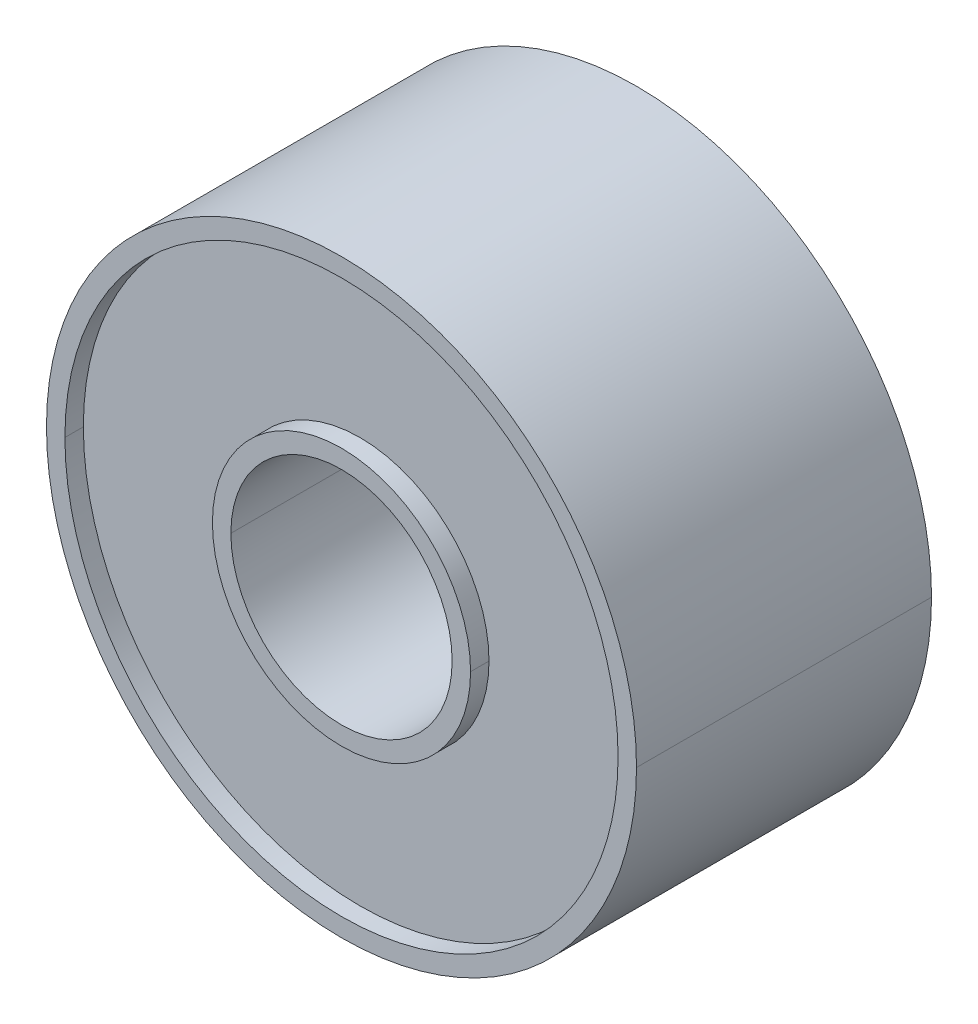
ISO-10303-21;
HEADER;
FILE_DESCRIPTION(('STEP AP214'),'2;1');
FILE_NAME('part.step','',(''),(''),'','','');
FILE_SCHEMA(('AUTOMOTIVE_DESIGN { 1 0 10303 214 1 1 1 1 }'));
ENDSEC;
DATA;
#1=APPLICATION_CONTEXT('core data for automotive mechanical design processes');
#2=APPLICATION_PROTOCOL_DEFINITION('international standard','automotive_design',2000,#1);
#3=PRODUCT_CONTEXT('',#1,'mechanical');
#4=PRODUCT('Part','Part','',(#3));
#5=PRODUCT_RELATED_PRODUCT_CATEGORY('part','',(#4));
#6=PRODUCT_DEFINITION_FORMATION('','',#4);
#7=PRODUCT_DEFINITION_CONTEXT('part definition',#1,'design');
#8=PRODUCT_DEFINITION('design','',#6,#7);
#9=PRODUCT_DEFINITION_SHAPE('','',#8);
#10=(LENGTH_UNIT() NAMED_UNIT(*) SI_UNIT(.MILLI.,.METRE.));
#11=(NAMED_UNIT(*) PLANE_ANGLE_UNIT() SI_UNIT($,.RADIAN.));
#12=(NAMED_UNIT(*) SI_UNIT($,.STERADIAN.) SOLID_ANGLE_UNIT());
#13=UNCERTAINTY_MEASURE_WITH_UNIT(LENGTH_MEASURE(1.E-05),#10,'distance_accuracy_value','');
#14=(GEOMETRIC_REPRESENTATION_CONTEXT(3) GLOBAL_UNCERTAINTY_ASSIGNED_CONTEXT((#13)) GLOBAL_UNIT_ASSIGNED_CONTEXT((#10,
#11,#12)) REPRESENTATION_CONTEXT('',''));
#15=CARTESIAN_POINT('',(0.,0.,0.));
#16=DIRECTION('',(0.,0.,1.));
#17=DIRECTION('',(1.,0.,0.));
#18=AXIS2_PLACEMENT_3D('',#15,#16,#17);
#19=CARTESIAN_POINT('',(0.,0.,0.25));
#20=DIRECTION('',(0.,0.,-1.));
#21=DIRECTION('',(0.,-1.,0.));
#22=AXIS2_PLACEMENT_3D('',#19,#20,#21);
#23=CYLINDRICAL_SURFACE('',#22,1.75);
#24=CARTESIAN_POINT('',(0.,0.,0.25));
#25=DIRECTION('',(0.,0.,-1.));
#26=DIRECTION('',(-1.,0.,0.));
#27=AXIS2_PLACEMENT_3D('',#24,#25,#26);
#28=CIRCLE('',#27,1.75);
#29=CARTESIAN_POINT('',(-1.75,0.,0.25));
#30=VERTEX_POINT('',#29);
#31=CARTESIAN_POINT('',(1.75,0.,0.25));
#32=VERTEX_POINT('',#31);
#33=EDGE_CURVE('E11',#30,#32,#28,.T.);
#34=ORIENTED_EDGE('',*,*,#33,.T.);
#35=DIRECTION('',(0.,0.,-1.));
#36=VECTOR('',#35,1.);
#37=CARTESIAN_POINT('',(1.75,0.,0.25));
#38=LINE('',#37,#36);
#39=CARTESIAN_POINT('',(1.75,0.,0.));
#40=VERTEX_POINT('',#39);
#41=EDGE_CURVE('E25',#32,#40,#38,.T.);
#42=ORIENTED_EDGE('',*,*,#41,.T.);
#43=CARTESIAN_POINT('',(0.,0.,0.));
#44=DIRECTION('',(0.,0.,-1.));
#45=DIRECTION('',(-1.,0.,0.));
#46=AXIS2_PLACEMENT_3D('',#43,#44,#45);
#47=CIRCLE('',#46,1.75);
#48=CARTESIAN_POINT('',(-1.75,0.,0.));
#49=VERTEX_POINT('',#48);
#50=EDGE_CURVE('E253',#49,#40,#47,.T.);
#51=ORIENTED_EDGE('',*,*,#50,.F.);
#52=DIRECTION('',(0.,0.,-1.));
#53=VECTOR('',#52,1.);
#54=CARTESIAN_POINT('',(-1.75,0.,0.25));
#55=LINE('',#54,#53);
#56=EDGE_CURVE('E248',#30,#49,#55,.T.);
#57=ORIENTED_EDGE('',*,*,#56,.F.);
#58=EDGE_LOOP('',(#34,#42,#51,#57));
#59=FACE_BOUND('',#58,.T.);
#60=ADVANCED_FACE('F17',(#59),#23,.T.);
#61=CARTESIAN_POINT('',(0.,0.,0.25));
#62=DIRECTION('',(0.,0.,-1.));
#63=DIRECTION('',(0.,1.,0.));
#64=AXIS2_PLACEMENT_3D('',#61,#62,#63);
#65=CYLINDRICAL_SURFACE('',#64,1.75);
#66=ORIENTED_EDGE('',*,*,#41,.F.);
#67=CARTESIAN_POINT('',(0.,0.,0.25));
#68=DIRECTION('',(0.,0.,-1.));
#69=DIRECTION('',(-1.,0.,0.));
#70=AXIS2_PLACEMENT_3D('',#67,#68,#69);
#71=CIRCLE('',#70,1.75);
#72=EDGE_CURVE('E243',#32,#30,#71,.T.);
#73=ORIENTED_EDGE('',*,*,#72,.T.);
#74=ORIENTED_EDGE('',*,*,#56,.T.);
#75=CARTESIAN_POINT('',(0.,0.,0.));
#76=DIRECTION('',(0.,0.,-1.));
#77=DIRECTION('',(-1.,0.,0.));
#78=AXIS2_PLACEMENT_3D('',#75,#76,#77);
#79=CIRCLE('',#78,1.75);
#80=EDGE_CURVE('E238',#40,#49,#79,.T.);
#81=ORIENTED_EDGE('',*,*,#80,.F.);
#82=EDGE_LOOP('',(#66,#73,#74,#81));
#83=FACE_BOUND('',#82,.T.);
#84=ADVANCED_FACE('F265',(#83),#65,.T.);
#85=CARTESIAN_POINT('',(0.,0.,0.));
#86=DIRECTION('',(0.,0.,1.));
#87=DIRECTION('',(1.,0.,0.));
#88=AXIS2_PLACEMENT_3D('',#85,#86,#87);
#89=PLANE('',#88);
#90=CARTESIAN_POINT('',(0.,0.,0.));
#91=DIRECTION('',(0.,0.,1.));
#92=DIRECTION('',(1.,0.,0.));
#93=AXIS2_PLACEMENT_3D('',#90,#91,#92);
#94=CIRCLE('',#93,1.5);
#95=CARTESIAN_POINT('',(-1.5,0.,0.));
#96=VERTEX_POINT('',#95);
#97=CARTESIAN_POINT('',(1.5,0.,0.));
#98=VERTEX_POINT('',#97);
#99=EDGE_CURVE('E234',#96,#98,#94,.T.);
#100=ORIENTED_EDGE('',*,*,#99,.T.);
#101=CARTESIAN_POINT('',(0.,0.,0.));
#102=DIRECTION('',(0.,0.,1.));
#103=DIRECTION('',(1.,0.,0.));
#104=AXIS2_PLACEMENT_3D('',#101,#102,#103);
#105=CIRCLE('',#104,1.5);
#106=EDGE_CURVE('E230',#98,#96,#105,.T.);
#107=ORIENTED_EDGE('',*,*,#106,.T.);
#108=EDGE_LOOP('',(#100,#107));
#109=FACE_BOUND('',#108,.T.);
#110=ORIENTED_EDGE('',*,*,#50,.T.);
#111=ORIENTED_EDGE('',*,*,#80,.T.);
#112=EDGE_LOOP('',(#110,#111));
#113=FACE_BOUND('',#112,.T.);
#114=ADVANCED_FACE('F263',(#109,#113),#89,.F.);
#115=CARTESIAN_POINT('',(0.,0.,4.));
#116=DIRECTION('',(0.,0.,-1.));
#117=DIRECTION('',(0.,-1.,0.));
#118=AXIS2_PLACEMENT_3D('',#115,#116,#117);
#119=CYLINDRICAL_SURFACE('',#118,1.5);
#120=DIRECTION('',(0.,0.,-1.));
#121=VECTOR('',#120,1.);
#122=CARTESIAN_POINT('',(1.5,0.,4.));
#123=LINE('',#122,#121);
#124=CARTESIAN_POINT('',(1.5,0.,4.));
#125=VERTEX_POINT('',#124);
#126=EDGE_CURVE('E225',#125,#98,#123,.T.);
#127=ORIENTED_EDGE('',*,*,#126,.F.);
#128=CARTESIAN_POINT('',(0.,0.,4.));
#129=DIRECTION('',(0.,0.,1.));
#130=DIRECTION('',(1.,0.,0.));
#131=AXIS2_PLACEMENT_3D('',#128,#129,#130);
#132=CIRCLE('',#131,1.5);
#133=CARTESIAN_POINT('',(-1.5,0.,4.));
#134=VERTEX_POINT('',#133);
#135=EDGE_CURVE('E221',#125,#134,#132,.T.);
#136=ORIENTED_EDGE('',*,*,#135,.T.);
#137=DIRECTION('',(0.,0.,-1.));
#138=VECTOR('',#137,1.);
#139=CARTESIAN_POINT('',(-1.5,0.,4.));
#140=LINE('',#139,#138);
#141=EDGE_CURVE('E216',#134,#96,#140,.T.);
#142=ORIENTED_EDGE('',*,*,#141,.T.);
#143=ORIENTED_EDGE('',*,*,#106,.F.);
#144=EDGE_LOOP('',(#127,#136,#142,#143));
#145=FACE_BOUND('',#144,.T.);
#146=ADVANCED_FACE('F281',(#145),#119,.F.);
#147=CARTESIAN_POINT('',(0.,0.,4.));
#148=DIRECTION('',(0.,0.,-1.));
#149=DIRECTION('',(0.,1.,0.));
#150=AXIS2_PLACEMENT_3D('',#147,#148,#149);
#151=CYLINDRICAL_SURFACE('',#150,1.5);
#152=CARTESIAN_POINT('',(0.,0.,4.));
#153=DIRECTION('',(0.,0.,1.));
#154=DIRECTION('',(1.,0.,0.));
#155=AXIS2_PLACEMENT_3D('',#152,#153,#154);
#156=CIRCLE('',#155,1.5);
#157=EDGE_CURVE('E211',#134,#125,#156,.T.);
#158=ORIENTED_EDGE('',*,*,#157,.T.);
#159=ORIENTED_EDGE('',*,*,#126,.T.);
#160=ORIENTED_EDGE('',*,*,#99,.F.);
#161=ORIENTED_EDGE('',*,*,#141,.F.);
#162=EDGE_LOOP('',(#158,#159,#160,#161));
#163=FACE_BOUND('',#162,.T.);
#164=ADVANCED_FACE('F287',(#163),#151,.F.);
#165=CARTESIAN_POINT('',(0.,0.,4.));
#166=DIRECTION('',(0.,0.,1.));
#167=DIRECTION('',(1.,0.,0.));
#168=AXIS2_PLACEMENT_3D('',#165,#166,#167);
#169=PLANE('',#168);
#170=ORIENTED_EDGE('',*,*,#157,.F.);
#171=ORIENTED_EDGE('',*,*,#135,.F.);
#172=EDGE_LOOP('',(#170,#171));
#173=FACE_BOUND('',#172,.T.);
#174=CARTESIAN_POINT('',(0.,0.,4.));
#175=DIRECTION('',(0.,0.,1.));
#176=DIRECTION('',(1.,0.,0.));
#177=AXIS2_PLACEMENT_3D('',#174,#175,#176);
#178=CIRCLE('',#177,1.75);
#179=CARTESIAN_POINT('',(1.75,0.,4.));
#180=VERTEX_POINT('',#179);
#181=CARTESIAN_POINT('',(-1.75,0.,4.));
#182=VERTEX_POINT('',#181);
#183=EDGE_CURVE('E207',#180,#182,#178,.T.);
#184=ORIENTED_EDGE('',*,*,#183,.T.);
#185=CARTESIAN_POINT('',(0.,0.,4.));
#186=DIRECTION('',(0.,0.,1.));
#187=DIRECTION('',(1.,0.,0.));
#188=AXIS2_PLACEMENT_3D('',#185,#186,#187);
#189=CIRCLE('',#188,1.75);
#190=EDGE_CURVE('E203',#182,#180,#189,.T.);
#191=ORIENTED_EDGE('',*,*,#190,.T.);
#192=EDGE_LOOP('',(#184,#191));
#193=FACE_BOUND('',#192,.T.);
#194=ADVANCED_FACE('F291',(#173,#193),#169,.T.);
#195=CARTESIAN_POINT('',(0.,0.,3.75));
#196=DIRECTION('',(0.,0.,1.));
#197=DIRECTION('',(0.,1.,0.));
#198=AXIS2_PLACEMENT_3D('',#195,#196,#197);
#199=CYLINDRICAL_SURFACE('',#198,1.75);
#200=DIRECTION('',(0.,0.,1.));
#201=VECTOR('',#200,1.);
#202=CARTESIAN_POINT('',(-1.75,0.,3.75));
#203=LINE('',#202,#201);
#204=CARTESIAN_POINT('',(-1.75,0.,3.75));
#205=VERTEX_POINT('',#204);
#206=EDGE_CURVE('E198',#205,#182,#203,.T.);
#207=ORIENTED_EDGE('',*,*,#206,.F.);
#208=CARTESIAN_POINT('',(0.,0.,3.75));
#209=DIRECTION('',(0.,0.,1.));
#210=DIRECTION('',(1.,0.,0.));
#211=AXIS2_PLACEMENT_3D('',#208,#209,#210);
#212=CIRCLE('',#211,1.75);
#213=CARTESIAN_POINT('',(1.75,0.,3.75));
#214=VERTEX_POINT('',#213);
#215=EDGE_CURVE('E194',#205,#214,#212,.T.);
#216=ORIENTED_EDGE('',*,*,#215,.T.);
#217=DIRECTION('',(0.,0.,1.));
#218=VECTOR('',#217,1.);
#219=CARTESIAN_POINT('',(1.75,0.,3.75));
#220=LINE('',#219,#218);
#221=EDGE_CURVE('E189',#214,#180,#220,.T.);
#222=ORIENTED_EDGE('',*,*,#221,.T.);
#223=ORIENTED_EDGE('',*,*,#190,.F.);
#224=EDGE_LOOP('',(#207,#216,#222,#223));
#225=FACE_BOUND('',#224,.T.);
#226=ADVANCED_FACE('F295',(#225),#199,.T.);
#227=CARTESIAN_POINT('',(0.,0.,3.75));
#228=DIRECTION('',(0.,0.,1.));
#229=DIRECTION('',(0.,-1.,0.));
#230=AXIS2_PLACEMENT_3D('',#227,#228,#229);
#231=CYLINDRICAL_SURFACE('',#230,1.75);
#232=CARTESIAN_POINT('',(0.,0.,3.75));
#233=DIRECTION('',(0.,0.,1.));
#234=DIRECTION('',(1.,0.,0.));
#235=AXIS2_PLACEMENT_3D('',#232,#233,#234);
#236=CIRCLE('',#235,1.75);
#237=EDGE_CURVE('E184',#214,#205,#236,.T.);
#238=ORIENTED_EDGE('',*,*,#237,.T.);
#239=ORIENTED_EDGE('',*,*,#206,.T.);
#240=ORIENTED_EDGE('',*,*,#183,.F.);
#241=ORIENTED_EDGE('',*,*,#221,.F.);
#242=EDGE_LOOP('',(#238,#239,#240,#241));
#243=FACE_BOUND('',#242,.T.);
#244=ADVANCED_FACE('F299',(#243),#231,.T.);
#245=CARTESIAN_POINT('',(0.,0.,3.75));
#246=DIRECTION('',(0.,0.,1.));
#247=DIRECTION('',(1.,0.,0.));
#248=AXIS2_PLACEMENT_3D('',#245,#246,#247);
#249=PLANE('',#248);
#250=ORIENTED_EDGE('',*,*,#237,.F.);
#251=ORIENTED_EDGE('',*,*,#215,.F.);
#252=EDGE_LOOP('',(#250,#251));
#253=FACE_BOUND('',#252,.T.);
#254=CARTESIAN_POINT('',(0.,0.,3.75));
#255=DIRECTION('',(0.,0.,1.));
#256=DIRECTION('',(1.,0.,0.));
#257=AXIS2_PLACEMENT_3D('',#254,#255,#256);
#258=CIRCLE('',#257,3.75);
#259=CARTESIAN_POINT('',(3.75,0.,3.75));
#260=VERTEX_POINT('',#259);
#261=CARTESIAN_POINT('',(-3.75,0.,3.75));
#262=VERTEX_POINT('',#261);
#263=EDGE_CURVE('E180',#260,#262,#258,.T.);
#264=ORIENTED_EDGE('',*,*,#263,.T.);
#265=CARTESIAN_POINT('',(0.,0.,3.75));
#266=DIRECTION('',(0.,0.,1.));
#267=DIRECTION('',(1.,0.,0.));
#268=AXIS2_PLACEMENT_3D('',#265,#266,#267);
#269=CIRCLE('',#268,3.75);
#270=EDGE_CURVE('E176',#262,#260,#269,.T.);
#271=ORIENTED_EDGE('',*,*,#270,.T.);
#272=EDGE_LOOP('',(#264,#271));
#273=FACE_BOUND('',#272,.T.);
#274=ADVANCED_FACE('F303',(#253,#273),#249,.T.);
#275=CARTESIAN_POINT('',(0.,0.,3.75));
#276=DIRECTION('',(0.,0.,1.));
#277=DIRECTION('',(0.,1.,0.));
#278=AXIS2_PLACEMENT_3D('',#275,#276,#277);
#279=CYLINDRICAL_SURFACE('',#278,3.75);
#280=ORIENTED_EDGE('',*,*,#270,.F.);
#281=DIRECTION('',(0.,0.,1.));
#282=VECTOR('',#281,1.);
#283=CARTESIAN_POINT('',(-3.75,0.,3.75));
#284=LINE('',#283,#282);
#285=CARTESIAN_POINT('',(-3.75,0.,4.));
#286=VERTEX_POINT('',#285);
#287=EDGE_CURVE('E172',#262,#286,#284,.T.);
#288=ORIENTED_EDGE('',*,*,#287,.T.);
#289=CARTESIAN_POINT('',(0.,0.,4.));
#290=DIRECTION('',(0.,0.,1.));
#291=DIRECTION('',(1.,0.,0.));
#292=AXIS2_PLACEMENT_3D('',#289,#290,#291);
#293=CIRCLE('',#292,3.75);
#294=CARTESIAN_POINT('',(3.75,0.,4.));
#295=VERTEX_POINT('',#294);
#296=EDGE_CURVE('E168',#286,#295,#293,.T.);
#297=ORIENTED_EDGE('',*,*,#296,.T.);
#298=DIRECTION('',(0.,0.,1.));
#299=VECTOR('',#298,1.);
#300=CARTESIAN_POINT('',(3.75,0.,3.75));
#301=LINE('',#300,#299);
#302=EDGE_CURVE('E163',#260,#295,#301,.T.);
#303=ORIENTED_EDGE('',*,*,#302,.F.);
#304=EDGE_LOOP('',(#280,#288,#297,#303));
#305=FACE_BOUND('',#304,.T.);
#306=ADVANCED_FACE('F307',(#305),#279,.F.);
#307=CARTESIAN_POINT('',(0.,0.,3.75));
#308=DIRECTION('',(0.,0.,1.));
#309=DIRECTION('',(0.,-1.,0.));
#310=AXIS2_PLACEMENT_3D('',#307,#308,#309);
#311=CYLINDRICAL_SURFACE('',#310,3.75);
#312=ORIENTED_EDGE('',*,*,#287,.F.);
#313=ORIENTED_EDGE('',*,*,#263,.F.);
#314=ORIENTED_EDGE('',*,*,#302,.T.);
#315=CARTESIAN_POINT('',(0.,0.,4.));
#316=DIRECTION('',(0.,0.,1.));
#317=DIRECTION('',(1.,0.,0.));
#318=AXIS2_PLACEMENT_3D('',#315,#316,#317);
#319=CIRCLE('',#318,3.75);
#320=EDGE_CURVE('E158',#295,#286,#319,.T.);
#321=ORIENTED_EDGE('',*,*,#320,.T.);
#322=EDGE_LOOP('',(#312,#313,#314,#321));
#323=FACE_BOUND('',#322,.T.);
#324=ADVANCED_FACE('F311',(#323),#311,.F.);
#325=CARTESIAN_POINT('',(0.,0.,4.));
#326=DIRECTION('',(0.,0.,1.));
#327=DIRECTION('',(1.,0.,0.));
#328=AXIS2_PLACEMENT_3D('',#325,#326,#327);
#329=PLANE('',#328);
#330=ORIENTED_EDGE('',*,*,#320,.F.);
#331=ORIENTED_EDGE('',*,*,#296,.F.);
#332=EDGE_LOOP('',(#330,#331));
#333=FACE_BOUND('',#332,.T.);
#334=CARTESIAN_POINT('',(0.,0.,4.));
#335=DIRECTION('',(0.,0.,1.));
#336=DIRECTION('',(1.,0.,0.));
#337=AXIS2_PLACEMENT_3D('',#334,#335,#336);
#338=CIRCLE('',#337,4.);
#339=CARTESIAN_POINT('',(-4.,0.,4.));
#340=VERTEX_POINT('',#339);
#341=CARTESIAN_POINT('',(4.,0.,4.));
#342=VERTEX_POINT('',#341);
#343=EDGE_CURVE('E154',#340,#342,#338,.T.);
#344=ORIENTED_EDGE('',*,*,#343,.T.);
#345=CARTESIAN_POINT('',(0.,0.,4.));
#346=DIRECTION('',(0.,0.,1.));
#347=DIRECTION('',(1.,0.,0.));
#348=AXIS2_PLACEMENT_3D('',#345,#346,#347);
#349=CIRCLE('',#348,4.);
#350=EDGE_CURVE('E150',#342,#340,#349,.T.);
#351=ORIENTED_EDGE('',*,*,#350,.T.);
#352=EDGE_LOOP('',(#344,#351));
#353=FACE_BOUND('',#352,.T.);
#354=ADVANCED_FACE('F315',(#333,#353),#329,.T.);
#355=CARTESIAN_POINT('',(0.,0.,4.));
#356=DIRECTION('',(0.,0.,-1.));
#357=DIRECTION('',(0.,-1.,0.));
#358=AXIS2_PLACEMENT_3D('',#355,#356,#357);
#359=CYLINDRICAL_SURFACE('',#358,4.);
#360=ORIENTED_EDGE('',*,*,#350,.F.);
#361=DIRECTION('',(0.,0.,-1.));
#362=VECTOR('',#361,1.);
#363=CARTESIAN_POINT('',(4.,0.,4.));
#364=LINE('',#363,#362);
#365=CARTESIAN_POINT('',(4.,0.,0.));
#366=VERTEX_POINT('',#365);
#367=EDGE_CURVE('E146',#342,#366,#364,.T.);
#368=ORIENTED_EDGE('',*,*,#367,.T.);
#369=CARTESIAN_POINT('',(0.,0.,0.));
#370=DIRECTION('',(0.,0.,1.));
#371=DIRECTION('',(1.,0.,0.));
#372=AXIS2_PLACEMENT_3D('',#369,#370,#371);
#373=CIRCLE('',#372,4.);
#374=CARTESIAN_POINT('',(-4.,0.,0.));
#375=VERTEX_POINT('',#374);
#376=EDGE_CURVE('E142',#366,#375,#373,.T.);
#377=ORIENTED_EDGE('',*,*,#376,.T.);
#378=DIRECTION('',(0.,0.,-1.));
#379=VECTOR('',#378,1.);
#380=CARTESIAN_POINT('',(-4.,0.,4.));
#381=LINE('',#380,#379);
#382=EDGE_CURVE('E137',#340,#375,#381,.T.);
#383=ORIENTED_EDGE('',*,*,#382,.F.);
#384=EDGE_LOOP('',(#360,#368,#377,#383));
#385=FACE_BOUND('',#384,.T.);
#386=ADVANCED_FACE('F319',(#385),#359,.T.);
#387=CARTESIAN_POINT('',(0.,0.,4.));
#388=DIRECTION('',(0.,0.,-1.));
#389=DIRECTION('',(0.,1.,0.));
#390=AXIS2_PLACEMENT_3D('',#387,#388,#389);
#391=CYLINDRICAL_SURFACE('',#390,4.);
#392=ORIENTED_EDGE('',*,*,#367,.F.);
#393=ORIENTED_EDGE('',*,*,#343,.F.);
#394=ORIENTED_EDGE('',*,*,#382,.T.);
#395=CARTESIAN_POINT('',(0.,0.,0.));
#396=DIRECTION('',(0.,0.,1.));
#397=DIRECTION('',(1.,0.,0.));
#398=AXIS2_PLACEMENT_3D('',#395,#396,#397);
#399=CIRCLE('',#398,4.);
#400=EDGE_CURVE('E132',#375,#366,#399,.T.);
#401=ORIENTED_EDGE('',*,*,#400,.T.);
#402=EDGE_LOOP('',(#392,#393,#394,#401));
#403=FACE_BOUND('',#402,.T.);
#404=ADVANCED_FACE('F323',(#403),#391,.T.);
#405=CARTESIAN_POINT('',(0.,0.,0.));
#406=DIRECTION('',(0.,0.,1.));
#407=DIRECTION('',(1.,0.,0.));
#408=AXIS2_PLACEMENT_3D('',#405,#406,#407);
#409=PLANE('',#408);
#410=CARTESIAN_POINT('',(0.,0.,0.));
#411=DIRECTION('',(0.,0.,-1.));
#412=DIRECTION('',(-1.,0.,0.));
#413=AXIS2_PLACEMENT_3D('',#410,#411,#412);
#414=CIRCLE('',#413,3.75);
#415=CARTESIAN_POINT('',(-3.75,0.,0.));
#416=VERTEX_POINT('',#415);
#417=CARTESIAN_POINT('',(3.75,0.,0.));
#418=VERTEX_POINT('',#417);
#419=EDGE_CURVE('E121',#416,#418,#414,.T.);
#420=ORIENTED_EDGE('',*,*,#419,.F.);
#421=CARTESIAN_POINT('',(0.,0.,0.));
#422=DIRECTION('',(0.,0.,-1.));
#423=DIRECTION('',(-1.,0.,0.));
#424=AXIS2_PLACEMENT_3D('',#421,#422,#423);
#425=CIRCLE('',#424,3.75);
#426=EDGE_CURVE('E109',#418,#416,#425,.T.);
#427=ORIENTED_EDGE('',*,*,#426,.F.);
#428=EDGE_LOOP('',(#420,#427));
#429=FACE_BOUND('',#428,.T.);
#430=ORIENTED_EDGE('',*,*,#400,.F.);
#431=ORIENTED_EDGE('',*,*,#376,.F.);
#432=EDGE_LOOP('',(#430,#431));
#433=FACE_BOUND('',#432,.T.);
#434=ADVANCED_FACE('F327',(#429,#433),#409,.F.);
#435=CARTESIAN_POINT('',(0.,0.,0.25));
#436=DIRECTION('',(0.,0.,-1.));
#437=DIRECTION('',(0.,1.,0.));
#438=AXIS2_PLACEMENT_3D('',#435,#436,#437);
#439=CYLINDRICAL_SURFACE('',#438,3.75);
#440=CARTESIAN_POINT('',(0.,0.,0.25));
#441=DIRECTION('',(0.,0.,-1.));
#442=DIRECTION('',(-1.,0.,0.));
#443=AXIS2_PLACEMENT_3D('',#440,#441,#442);
#444=CIRCLE('',#443,3.75);
#445=CARTESIAN_POINT('',(3.75,0.,0.25));
#446=VERTEX_POINT('',#445);
#447=CARTESIAN_POINT('',(-3.75,0.,0.25));
#448=VERTEX_POINT('',#447);
#449=EDGE_CURVE('E107',#446,#448,#444,.T.);
#450=ORIENTED_EDGE('',*,*,#449,.F.);
#451=DIRECTION('',(0.,0.,-1.));
#452=VECTOR('',#451,1.);
#453=CARTESIAN_POINT('',(3.75,0.,0.25));
#454=LINE('',#453,#452);
#455=EDGE_CURVE('E112',#446,#418,#454,.T.);
#456=ORIENTED_EDGE('',*,*,#455,.T.);
#457=ORIENTED_EDGE('',*,*,#426,.T.);
#458=DIRECTION('',(0.,0.,-1.));
#459=VECTOR('',#458,1.);
#460=CARTESIAN_POINT('',(-3.75,0.,0.25));
#461=LINE('',#460,#459);
#462=EDGE_CURVE('E102',#448,#416,#461,.T.);
#463=ORIENTED_EDGE('',*,*,#462,.F.);
#464=EDGE_LOOP('',(#450,#456,#457,#463));
#465=FACE_BOUND('',#464,.T.);
#466=ADVANCED_FACE('F104',(#465),#439,.F.);
#467=CARTESIAN_POINT('',(0.,0.,0.25));
#468=DIRECTION('',(0.,0.,-1.));
#469=DIRECTION('',(0.,-1.,0.));
#470=AXIS2_PLACEMENT_3D('',#467,#468,#469);
#471=CYLINDRICAL_SURFACE('',#470,3.75);
#472=ORIENTED_EDGE('',*,*,#455,.F.);
#473=CARTESIAN_POINT('',(0.,0.,0.25));
#474=DIRECTION('',(0.,0.,-1.));
#475=DIRECTION('',(-1.,0.,0.));
#476=AXIS2_PLACEMENT_3D('',#473,#474,#475);
#477=CIRCLE('',#476,3.75);
#478=EDGE_CURVE('E113',#448,#446,#477,.T.);
#479=ORIENTED_EDGE('',*,*,#478,.F.);
#480=ORIENTED_EDGE('',*,*,#462,.T.);
#481=ORIENTED_EDGE('',*,*,#419,.T.);
#482=EDGE_LOOP('',(#472,#479,#480,#481));
#483=FACE_BOUND('',#482,.T.);
#484=ADVANCED_FACE('F116',(#483),#471,.F.);
#485=CARTESIAN_POINT('',(0.,0.,0.25));
#486=DIRECTION('',(0.,0.,-1.));
#487=DIRECTION('',(-1.,0.,0.));
#488=AXIS2_PLACEMENT_3D('',#485,#486,#487);
#489=PLANE('',#488);
#490=ORIENTED_EDGE('',*,*,#33,.F.);
#491=ORIENTED_EDGE('',*,*,#72,.F.);
#492=EDGE_LOOP('',(#490,#491));
#493=FACE_BOUND('',#492,.T.);
#494=ORIENTED_EDGE('',*,*,#478,.T.);
#495=ORIENTED_EDGE('',*,*,#449,.T.);
#496=EDGE_LOOP('',(#494,#495));
#497=FACE_BOUND('',#496,.T.);
#498=ADVANCED_FACE('F119',(#493,#497),#489,.T.);
#499=CLOSED_SHELL('',(#60,#84,#114,#146,#164,#194,#226,#244,#274,#306,#324,#354,#386,#404,#434,
#466,#484,#498));
#500=MANIFOLD_SOLID_BREP('B1',#499);
#501=ADVANCED_BREP_SHAPE_REPRESENTATION('',(#18,#500),#14);
#502=SHAPE_DEFINITION_REPRESENTATION(#9,#501);
ENDSEC;
END-ISO-10303-21;
